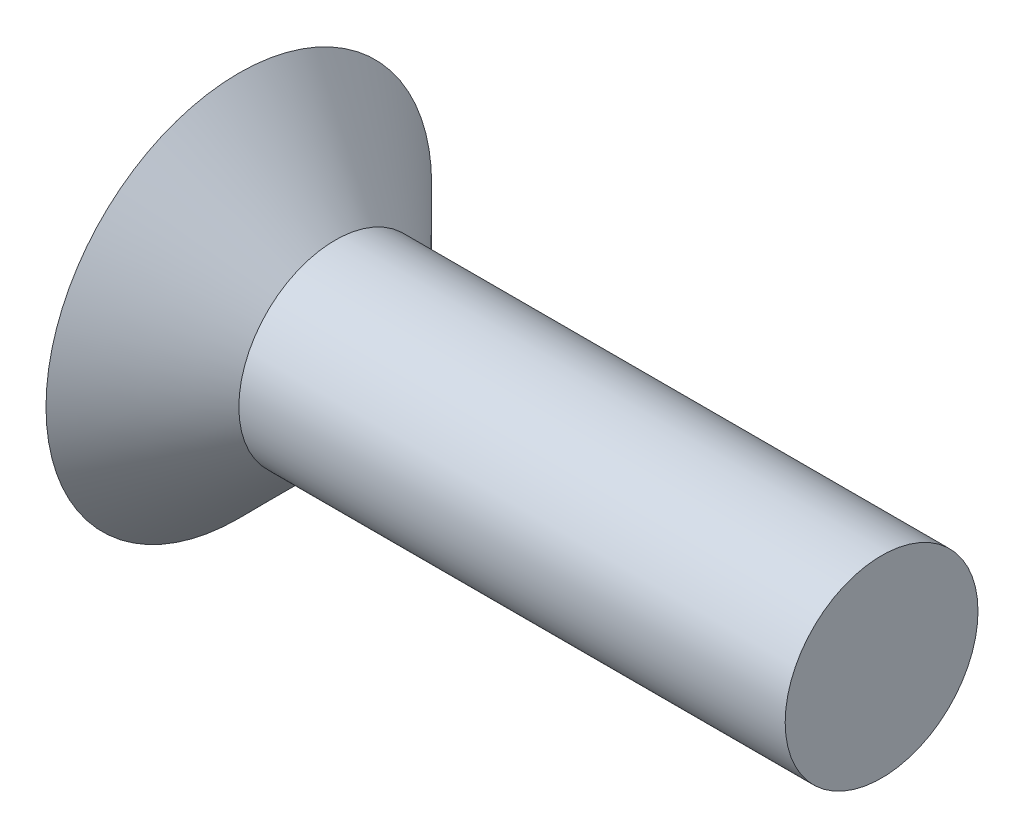
ISO-10303-21;
HEADER;
FILE_DESCRIPTION(('STEP AP214'),'2;1');
FILE_NAME('part.step','',(''),(''),'','','');
FILE_SCHEMA(('AUTOMOTIVE_DESIGN { 1 0 10303 214 1 1 1 1 }'));
ENDSEC;
DATA;
#1=APPLICATION_CONTEXT('core data for automotive mechanical design processes');
#2=APPLICATION_PROTOCOL_DEFINITION('international standard','automotive_design',2000,#1);
#3=PRODUCT_CONTEXT('',#1,'mechanical');
#4=PRODUCT('Part','Part','',(#3));
#5=PRODUCT_RELATED_PRODUCT_CATEGORY('part','',(#4));
#6=PRODUCT_DEFINITION_FORMATION('','',#4);
#7=PRODUCT_DEFINITION_CONTEXT('part definition',#1,'design');
#8=PRODUCT_DEFINITION('design','',#6,#7);
#9=PRODUCT_DEFINITION_SHAPE('','',#8);
#10=(LENGTH_UNIT() NAMED_UNIT(*) SI_UNIT(.MILLI.,.METRE.));
#11=(NAMED_UNIT(*) PLANE_ANGLE_UNIT() SI_UNIT($,.RADIAN.));
#12=(NAMED_UNIT(*) SI_UNIT($,.STERADIAN.) SOLID_ANGLE_UNIT());
#13=UNCERTAINTY_MEASURE_WITH_UNIT(LENGTH_MEASURE(1.E-05),#10,'distance_accuracy_value','');
#14=(GEOMETRIC_REPRESENTATION_CONTEXT(3) GLOBAL_UNCERTAINTY_ASSIGNED_CONTEXT((#13)) GLOBAL_UNIT_ASSIGNED_CONTEXT((#10,
#11,#12)) REPRESENTATION_CONTEXT('',''));
#15=CARTESIAN_POINT('',(0.,0.,0.));
#16=DIRECTION('',(0.,0.,1.));
#17=DIRECTION('',(1.,0.,0.));
#18=AXIS2_PLACEMENT_3D('',#15,#16,#17);
#19=CARTESIAN_POINT('',(0.,0.,0.));
#20=DIRECTION('',(-1.,0.,0.));
#21=DIRECTION('',(0.,0.,1.));
#22=AXIS2_PLACEMENT_3D('',#19,#20,#21);
#23=PLANE('',#22);
#24=DIRECTION('',(0.,0.5,-0.866025403784439));
#25=VECTOR('',#24,1.);
#26=CARTESIAN_POINT('',(0.,0.577350269189626,1.));
#27=LINE('',#26,#25);
#28=CARTESIAN_POINT('',(0.,0.577350269189626,1.));
#29=VERTEX_POINT('',#28);
#30=CARTESIAN_POINT('',(0.,1.15470053837925,0.));
#31=VERTEX_POINT('',#30);
#32=EDGE_CURVE('E54',#29,#31,#27,.T.);
#33=ORIENTED_EDGE('',*,*,#32,.F.);
#34=DIRECTION('',(0.,1.,0.));
#35=VECTOR('',#34,1.);
#36=CARTESIAN_POINT('',(0.,-0.577350269189626,1.));
#37=LINE('',#36,#35);
#38=CARTESIAN_POINT('',(0.,-0.577350269189626,1.));
#39=VERTEX_POINT('',#38);
#40=EDGE_CURVE('E137',#39,#29,#37,.T.);
#41=ORIENTED_EDGE('',*,*,#40,.F.);
#42=DIRECTION('',(0.,0.5,0.866025403784439));
#43=VECTOR('',#42,1.);
#44=CARTESIAN_POINT('',(0.,-1.15470053837925,0.));
#45=LINE('',#44,#43);
#46=CARTESIAN_POINT('',(0.,-1.15470053837925,0.));
#47=VERTEX_POINT('',#46);
#48=EDGE_CURVE('E135',#47,#39,#45,.T.);
#49=ORIENTED_EDGE('',*,*,#48,.F.);
#50=DIRECTION('',(0.,-0.5,0.866025403784439));
#51=VECTOR('',#50,1.);
#52=CARTESIAN_POINT('',(0.,-0.577350269189626,-1.));
#53=LINE('',#52,#51);
#54=CARTESIAN_POINT('',(0.,-0.577350269189626,-1.));
#55=VERTEX_POINT('',#54);
#56=EDGE_CURVE('E102',#55,#47,#53,.T.);
#57=ORIENTED_EDGE('',*,*,#56,.F.);
#58=DIRECTION('',(0.,-1.,0.));
#59=VECTOR('',#58,1.);
#60=CARTESIAN_POINT('',(0.,0.577350269189626,-1.));
#61=LINE('',#60,#59);
#62=CARTESIAN_POINT('',(0.,0.577350269189626,-1.));
#63=VERTEX_POINT('',#62);
#64=EDGE_CURVE('E131',#63,#55,#61,.T.);
#65=ORIENTED_EDGE('',*,*,#64,.F.);
#66=DIRECTION('',(0.,-0.5,-0.866025403784439));
#67=VECTOR('',#66,1.);
#68=CARTESIAN_POINT('',(0.,1.15470053837925,0.));
#69=LINE('',#68,#67);
#70=EDGE_CURVE('E128',#31,#63,#69,.T.);
#71=ORIENTED_EDGE('',*,*,#70,.F.);
#72=EDGE_LOOP('',(#33,#41,#49,#57,#65,#71));
#73=FACE_BOUND('',#72,.T.);
#74=CARTESIAN_POINT('',(0.,0.,0.));
#75=DIRECTION('',(-1.,0.,0.));
#76=DIRECTION('',(0.,0.,1.));
#77=AXIS2_PLACEMENT_3D('',#74,#75,#76);
#78=CIRCLE('',#77,3.);
#79=CARTESIAN_POINT('',(0.,0.,3.));
#80=VERTEX_POINT('',#79);
#81=EDGE_CURVE('E141',#80,#80,#78,.T.);
#82=ORIENTED_EDGE('',*,*,#81,.T.);
#83=EDGE_LOOP('',(#82));
#84=FACE_BOUND('',#83,.T.);
#85=ADVANCED_FACE('F40',(#73,#84),#23,.T.);
#86=CARTESIAN_POINT('',(10.,0.,0.));
#87=DIRECTION('',(-1.,0.,0.));
#88=DIRECTION('',(0.,0.,1.));
#89=AXIS2_PLACEMENT_3D('',#86,#87,#88);
#90=PLANE('',#89);
#91=CARTESIAN_POINT('',(10.,0.,0.));
#92=DIRECTION('',(-1.,0.,0.));
#93=DIRECTION('',(0.,0.,1.));
#94=AXIS2_PLACEMENT_3D('',#91,#92,#93);
#95=CIRCLE('',#94,1.5);
#96=CARTESIAN_POINT('',(10.,0.,1.5));
#97=VERTEX_POINT('',#96);
#98=EDGE_CURVE('E11',#97,#97,#95,.T.);
#99=ORIENTED_EDGE('',*,*,#98,.F.);
#100=EDGE_LOOP('',(#99));
#101=FACE_BOUND('',#100,.T.);
#102=ADVANCED_FACE('F156',(#101),#90,.F.);
#103=CARTESIAN_POINT('',(0.,0.,0.));
#104=DIRECTION('',(-1.,0.,0.));
#105=DIRECTION('',(0.,0.,1.));
#106=AXIS2_PLACEMENT_3D('',#103,#104,#105);
#107=CYLINDRICAL_SURFACE('',#106,1.5);
#108=CARTESIAN_POINT('',(1.50000000000001,0.,0.));
#109=DIRECTION('',(-1.,0.,0.));
#110=DIRECTION('',(0.,0.,1.));
#111=AXIS2_PLACEMENT_3D('',#108,#109,#110);
#112=CIRCLE('',#111,1.5);
#113=CARTESIAN_POINT('',(1.50000000000001,0.,1.5));
#114=VERTEX_POINT('',#113);
#115=EDGE_CURVE('E47',#114,#114,#112,.T.);
#116=ORIENTED_EDGE('',*,*,#115,.F.);
#117=EDGE_LOOP('',(#116));
#118=FACE_BOUND('',#117,.T.);
#119=ORIENTED_EDGE('',*,*,#98,.T.);
#120=EDGE_LOOP('',(#119));
#121=FACE_BOUND('',#120,.T.);
#122=ADVANCED_FACE('F153',(#118,#121),#107,.T.);
#123=CARTESIAN_POINT('',(1.50000000000001,0.,0.));
#124=DIRECTION('',(-1.,0.,0.));
#125=DIRECTION('',(0.,0.,1.));
#126=AXIS2_PLACEMENT_3D('',#123,#124,#125);
#127=CONICAL_SURFACE('',#126,1.5,0.785398163397446);
#128=ORIENTED_EDGE('',*,*,#81,.F.);
#129=EDGE_LOOP('',(#128));
#130=FACE_BOUND('',#129,.T.);
#131=ORIENTED_EDGE('',*,*,#115,.T.);
#132=EDGE_LOOP('',(#131));
#133=FACE_BOUND('',#132,.T.);
#134=ADVANCED_FACE('F151',(#130,#133),#127,.T.);
#135=CARTESIAN_POINT('',(1.,0.577350269189626,1.));
#136=DIRECTION('',(0.,0.866025403784439,0.5));
#137=DIRECTION('',(0.,-0.5,0.866025403784439));
#138=AXIS2_PLACEMENT_3D('',#135,#136,#137);
#139=PLANE('',#138);
#140=ORIENTED_EDGE('',*,*,#32,.T.);
#141=DIRECTION('',(-1.,0.,0.));
#142=VECTOR('',#141,1.);
#143=CARTESIAN_POINT('',(1.,1.15470053837925,0.));
#144=LINE('',#143,#142);
#145=CARTESIAN_POINT('',(1.,1.15470053837925,0.));
#146=VERTEX_POINT('',#145);
#147=EDGE_CURVE('E84',#146,#31,#144,.T.);
#148=ORIENTED_EDGE('',*,*,#147,.F.);
#149=DIRECTION('',(0.,0.5,-0.866025403784439));
#150=VECTOR('',#149,1.);
#151=CARTESIAN_POINT('',(1.,0.577350269189626,1.));
#152=LINE('',#151,#150);
#153=CARTESIAN_POINT('',(1.,0.577350269189626,1.));
#154=VERTEX_POINT('',#153);
#155=EDGE_CURVE('E139',#154,#146,#152,.T.);
#156=ORIENTED_EDGE('',*,*,#155,.F.);
#157=DIRECTION('',(-1.,0.,0.));
#158=VECTOR('',#157,1.);
#159=CARTESIAN_POINT('',(1.,0.577350269189626,1.));
#160=LINE('',#159,#158);
#161=EDGE_CURVE('E62',#154,#29,#160,.T.);
#162=ORIENTED_EDGE('',*,*,#161,.T.);
#163=EDGE_LOOP('',(#140,#148,#156,#162));
#164=FACE_BOUND('',#163,.T.);
#165=ADVANCED_FACE('F168',(#164),#139,.F.);
#166=CARTESIAN_POINT('',(1.,-0.577350269189626,1.));
#167=DIRECTION('',(0.,0.,1.));
#168=DIRECTION('',(1.,0.,0.));
#169=AXIS2_PLACEMENT_3D('',#166,#167,#168);
#170=PLANE('',#169);
#171=ORIENTED_EDGE('',*,*,#40,.T.);
#172=ORIENTED_EDGE('',*,*,#161,.F.);
#173=DIRECTION('',(0.,1.,0.));
#174=VECTOR('',#173,1.);
#175=CARTESIAN_POINT('',(1.,-0.577350269189626,1.));
#176=LINE('',#175,#174);
#177=CARTESIAN_POINT('',(1.,-0.577350269189626,1.));
#178=VERTEX_POINT('',#177);
#179=EDGE_CURVE('E114',#178,#154,#176,.T.);
#180=ORIENTED_EDGE('',*,*,#179,.F.);
#181=DIRECTION('',(-1.,0.,0.));
#182=VECTOR('',#181,1.);
#183=CARTESIAN_POINT('',(1.,-0.577350269189626,1.));
#184=LINE('',#183,#182);
#185=EDGE_CURVE('E106',#178,#39,#184,.T.);
#186=ORIENTED_EDGE('',*,*,#185,.T.);
#187=EDGE_LOOP('',(#171,#172,#180,#186));
#188=FACE_BOUND('',#187,.T.);
#189=ADVANCED_FACE('F172',(#188),#170,.F.);
#190=CARTESIAN_POINT('',(1.,-1.15470053837925,0.));
#191=DIRECTION('',(0.,-0.866025403784439,0.5));
#192=DIRECTION('',(0.,-0.5,-0.866025403784439));
#193=AXIS2_PLACEMENT_3D('',#190,#191,#192);
#194=PLANE('',#193);
#195=ORIENTED_EDGE('',*,*,#48,.T.);
#196=ORIENTED_EDGE('',*,*,#185,.F.);
#197=DIRECTION('',(0.,0.5,0.866025403784439));
#198=VECTOR('',#197,1.);
#199=CARTESIAN_POINT('',(1.,-1.15470053837925,0.));
#200=LINE('',#199,#198);
#201=CARTESIAN_POINT('',(1.,-1.15470053837925,0.));
#202=VERTEX_POINT('',#201);
#203=EDGE_CURVE('E110',#202,#178,#200,.T.);
#204=ORIENTED_EDGE('',*,*,#203,.F.);
#205=DIRECTION('',(-1.,0.,0.));
#206=VECTOR('',#205,1.);
#207=CARTESIAN_POINT('',(1.,-1.15470053837925,0.));
#208=LINE('',#207,#206);
#209=EDGE_CURVE('E95',#202,#47,#208,.T.);
#210=ORIENTED_EDGE('',*,*,#209,.T.);
#211=EDGE_LOOP('',(#195,#196,#204,#210));
#212=FACE_BOUND('',#211,.T.);
#213=ADVANCED_FACE('F111',(#212),#194,.F.);
#214=CARTESIAN_POINT('',(1.,-0.577350269189626,-1.));
#215=DIRECTION('',(0.,-0.866025403784439,-0.5));
#216=DIRECTION('',(0.,0.5,-0.866025403784439));
#217=AXIS2_PLACEMENT_3D('',#214,#215,#216);
#218=PLANE('',#217);
#219=ORIENTED_EDGE('',*,*,#56,.T.);
#220=ORIENTED_EDGE('',*,*,#209,.F.);
#221=DIRECTION('',(0.,-0.5,0.866025403784439));
#222=VECTOR('',#221,1.);
#223=CARTESIAN_POINT('',(1.,-0.577350269189626,-1.));
#224=LINE('',#223,#222);
#225=CARTESIAN_POINT('',(1.,-0.577350269189626,-1.));
#226=VERTEX_POINT('',#225);
#227=EDGE_CURVE('E99',#226,#202,#224,.T.);
#228=ORIENTED_EDGE('',*,*,#227,.F.);
#229=DIRECTION('',(-1.,0.,0.));
#230=VECTOR('',#229,1.);
#231=CARTESIAN_POINT('',(1.,-0.577350269189626,-1.));
#232=LINE('',#231,#230);
#233=EDGE_CURVE('E107',#226,#55,#232,.T.);
#234=ORIENTED_EDGE('',*,*,#233,.T.);
#235=EDGE_LOOP('',(#219,#220,#228,#234));
#236=FACE_BOUND('',#235,.T.);
#237=ADVANCED_FACE('F97',(#236),#218,.F.);
#238=CARTESIAN_POINT('',(1.,0.577350269189626,-1.));
#239=DIRECTION('',(0.,0.,-1.));
#240=DIRECTION('',(-1.,0.,0.));
#241=AXIS2_PLACEMENT_3D('',#238,#239,#240);
#242=PLANE('',#241);
#243=ORIENTED_EDGE('',*,*,#64,.T.);
#244=ORIENTED_EDGE('',*,*,#233,.F.);
#245=DIRECTION('',(0.,-1.,0.));
#246=VECTOR('',#245,1.);
#247=CARTESIAN_POINT('',(1.,0.577350269189626,-1.));
#248=LINE('',#247,#246);
#249=CARTESIAN_POINT('',(1.,0.577350269189626,-1.));
#250=VERTEX_POINT('',#249);
#251=EDGE_CURVE('E120',#250,#226,#248,.T.);
#252=ORIENTED_EDGE('',*,*,#251,.F.);
#253=DIRECTION('',(-1.,0.,0.));
#254=VECTOR('',#253,1.);
#255=CARTESIAN_POINT('',(1.,0.577350269189626,-1.));
#256=LINE('',#255,#254);
#257=EDGE_CURVE('E144',#250,#63,#256,.T.);
#258=ORIENTED_EDGE('',*,*,#257,.T.);
#259=EDGE_LOOP('',(#243,#244,#252,#258));
#260=FACE_BOUND('',#259,.T.);
#261=ADVANCED_FACE('F176',(#260),#242,.F.);
#262=CARTESIAN_POINT('',(1.,1.15470053837925,0.));
#263=DIRECTION('',(0.,0.866025403784439,-0.5));
#264=DIRECTION('',(0.,0.5,0.866025403784439));
#265=AXIS2_PLACEMENT_3D('',#262,#263,#264);
#266=PLANE('',#265);
#267=ORIENTED_EDGE('',*,*,#70,.T.);
#268=ORIENTED_EDGE('',*,*,#257,.F.);
#269=DIRECTION('',(0.,-0.5,-0.866025403784439));
#270=VECTOR('',#269,1.);
#271=CARTESIAN_POINT('',(1.,1.15470053837925,0.));
#272=LINE('',#271,#270);
#273=EDGE_CURVE('E122',#146,#250,#272,.T.);
#274=ORIENTED_EDGE('',*,*,#273,.F.);
#275=ORIENTED_EDGE('',*,*,#147,.T.);
#276=EDGE_LOOP('',(#267,#268,#274,#275));
#277=FACE_BOUND('',#276,.T.);
#278=ADVANCED_FACE('F173',(#277),#266,.F.);
#279=CARTESIAN_POINT('',(1.,0.,0.));
#280=DIRECTION('',(-1.,0.,0.));
#281=DIRECTION('',(0.,0.,1.));
#282=AXIS2_PLACEMENT_3D('',#279,#280,#281);
#283=PLANE('',#282);
#284=ORIENTED_EDGE('',*,*,#155,.T.);
#285=ORIENTED_EDGE('',*,*,#273,.T.);
#286=ORIENTED_EDGE('',*,*,#251,.T.);
#287=ORIENTED_EDGE('',*,*,#227,.T.);
#288=ORIENTED_EDGE('',*,*,#203,.T.);
#289=ORIENTED_EDGE('',*,*,#179,.T.);
#290=EDGE_LOOP('',(#284,#285,#286,#287,#288,#289));
#291=FACE_BOUND('',#290,.T.);
#292=ADVANCED_FACE('F117',(#291),#283,.T.);
#293=CLOSED_SHELL('',(#85,#102,#122,#134,#165,#189,#213,#237,#261,#278,#292));
#294=MANIFOLD_SOLID_BREP('B2',#293);
#295=ADVANCED_BREP_SHAPE_REPRESENTATION('',(#18,#294),#14);
#296=SHAPE_DEFINITION_REPRESENTATION(#9,#295);
ENDSEC;
END-ISO-10303-21;
